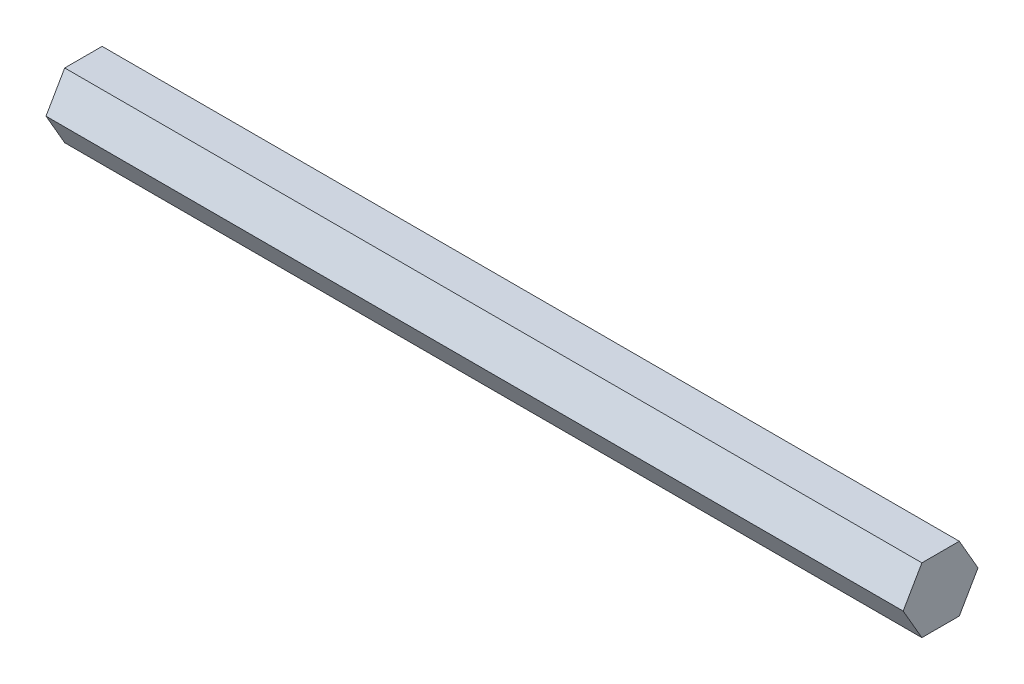
ISO-10303-21;
HEADER;
FILE_DESCRIPTION(('STEP AP214'),'2;1');
FILE_NAME('part.step','',(''),(''),'','','');
FILE_SCHEMA(('AUTOMOTIVE_DESIGN { 1 0 10303 214 1 1 1 1 }'));
ENDSEC;
DATA;
#1=APPLICATION_CONTEXT('core data for automotive mechanical design processes');
#2=APPLICATION_PROTOCOL_DEFINITION('international standard','automotive_design',2000,#1);
#3=PRODUCT_CONTEXT('',#1,'mechanical');
#4=PRODUCT('Part','Part','',(#3));
#5=PRODUCT_RELATED_PRODUCT_CATEGORY('part','',(#4));
#6=PRODUCT_DEFINITION_FORMATION('','',#4);
#7=PRODUCT_DEFINITION_CONTEXT('part definition',#1,'design');
#8=PRODUCT_DEFINITION('design','',#6,#7);
#9=PRODUCT_DEFINITION_SHAPE('','',#8);
#10=(LENGTH_UNIT() NAMED_UNIT(*) SI_UNIT(.MILLI.,.METRE.));
#11=(NAMED_UNIT(*) PLANE_ANGLE_UNIT() SI_UNIT($,.RADIAN.));
#12=(NAMED_UNIT(*) SI_UNIT($,.STERADIAN.) SOLID_ANGLE_UNIT());
#13=UNCERTAINTY_MEASURE_WITH_UNIT(LENGTH_MEASURE(1.E-05),#10,'distance_accuracy_value','');
#14=(GEOMETRIC_REPRESENTATION_CONTEXT(3) GLOBAL_UNCERTAINTY_ASSIGNED_CONTEXT((#13)) GLOBAL_UNIT_ASSIGNED_CONTEXT((#10,
#11,#12)) REPRESENTATION_CONTEXT('',''));
#15=CARTESIAN_POINT('',(0.,0.,0.));
#16=DIRECTION('',(0.,0.,1.));
#17=DIRECTION('',(1.,0.,0.));
#18=AXIS2_PLACEMENT_3D('',#15,#16,#17);
#19=CARTESIAN_POINT('',(168.,-6.34999999999996,-3.6661742093542));
#20=DIRECTION('',(0.,0.499999999999995,0.866025403784441));
#21=DIRECTION('',(0.,-0.866025403784442,0.499999999999995));
#22=AXIS2_PLACEMENT_3D('',#19,#20,#21);
#23=PLANE('',#22);
#24=DIRECTION('',(0.,0.866025403784441,-0.499999999999995));
#25=VECTOR('',#24,1.);
#26=CARTESIAN_POINT('',(0.,-6.34999999999996,-3.6661742093542));
#27=LINE('',#26,#25);
#28=CARTESIAN_POINT('',(0.,-6.34999999999996,-3.6661742093542));
#29=VERTEX_POINT('',#28);
#30=CARTESIAN_POINT('',(0.,0.,-7.33234841870825));
#31=VERTEX_POINT('',#30);
#32=EDGE_CURVE('E132',#29,#31,#27,.T.);
#33=ORIENTED_EDGE('',*,*,#32,.T.);
#34=DIRECTION('',(-1.,0.,0.));
#35=VECTOR('',#34,1.);
#36=CARTESIAN_POINT('',(168.,0.,-7.33234841870825));
#37=LINE('',#36,#35);
#38=CARTESIAN_POINT('',(168.,0.,-7.33234841870825));
#39=VERTEX_POINT('',#38);
#40=EDGE_CURVE('E11',#39,#31,#37,.T.);
#41=ORIENTED_EDGE('',*,*,#40,.F.);
#42=DIRECTION('',(0.,0.866025403784441,-0.499999999999995));
#43=VECTOR('',#42,1.);
#44=CARTESIAN_POINT('',(168.,-6.34999999999996,-3.6661742093542));
#45=LINE('',#44,#43);
#46=CARTESIAN_POINT('',(168.,-6.34999999999996,-3.6661742093542));
#47=VERTEX_POINT('',#46);
#48=EDGE_CURVE('E148',#47,#39,#45,.T.);
#49=ORIENTED_EDGE('',*,*,#48,.F.);
#50=DIRECTION('',(-1.,0.,0.));
#51=VECTOR('',#50,1.);
#52=CARTESIAN_POINT('',(168.,-6.34999999999996,-3.6661742093542));
#53=LINE('',#52,#51);
#54=EDGE_CURVE('E128',#47,#29,#53,.T.);
#55=ORIENTED_EDGE('',*,*,#54,.T.);
#56=EDGE_LOOP('',(#33,#41,#49,#55));
#57=FACE_BOUND('',#56,.T.);
#58=ADVANCED_FACE('F43',(#57),#23,.F.);
#59=CARTESIAN_POINT('',(168.,0.,-7.33234841870825));
#60=DIRECTION('',(0.,-0.500000000000001,0.866025403784438));
#61=DIRECTION('',(0.,-0.866025403784438,-0.500000000000001));
#62=AXIS2_PLACEMENT_3D('',#59,#60,#61);
#63=PLANE('',#62);
#64=DIRECTION('',(0.,0.866025403784438,0.500000000000001));
#65=VECTOR('',#64,1.);
#66=CARTESIAN_POINT('',(0.,0.,-7.33234841870825));
#67=LINE('',#66,#65);
#68=CARTESIAN_POINT('',(0.,6.35000000000001,-3.66617420935411));
#69=VERTEX_POINT('',#68);
#70=EDGE_CURVE('E136',#31,#69,#67,.T.);
#71=ORIENTED_EDGE('',*,*,#70,.T.);
#72=DIRECTION('',(-1.,0.,0.));
#73=VECTOR('',#72,1.);
#74=CARTESIAN_POINT('',(168.,6.35000000000001,-3.66617420935411));
#75=LINE('',#74,#73);
#76=CARTESIAN_POINT('',(168.,6.35000000000001,-3.66617420935411));
#77=VERTEX_POINT('',#76);
#78=EDGE_CURVE('E52',#77,#69,#75,.T.);
#79=ORIENTED_EDGE('',*,*,#78,.F.);
#80=DIRECTION('',(0.,0.866025403784438,0.500000000000001));
#81=VECTOR('',#80,1.);
#82=CARTESIAN_POINT('',(168.,0.,-7.33234841870825));
#83=LINE('',#82,#81);
#84=EDGE_CURVE('E97',#39,#77,#83,.T.);
#85=ORIENTED_EDGE('',*,*,#84,.F.);
#86=ORIENTED_EDGE('',*,*,#40,.T.);
#87=EDGE_LOOP('',(#71,#79,#85,#86));
#88=FACE_BOUND('',#87,.T.);
#89=ADVANCED_FACE('F176',(#88),#63,.F.);
#90=CARTESIAN_POINT('',(168.,6.35000000000001,-3.66617420935411));
#91=DIRECTION('',(0.,-1.,0.));
#92=DIRECTION('',(0.,0.,-1.));
#93=AXIS2_PLACEMENT_3D('',#90,#91,#92);
#94=PLANE('',#93);
#95=DIRECTION('',(0.,0.,1.));
#96=VECTOR('',#95,1.);
#97=CARTESIAN_POINT('',(0.,6.35000000000001,-3.66617420935411));
#98=LINE('',#97,#96);
#99=CARTESIAN_POINT('',(0.,6.34999999999999,3.66617420935415));
#100=VERTEX_POINT('',#99);
#101=EDGE_CURVE('E139',#69,#100,#98,.T.);
#102=ORIENTED_EDGE('',*,*,#101,.T.);
#103=DIRECTION('',(-1.,0.,0.));
#104=VECTOR('',#103,1.);
#105=CARTESIAN_POINT('',(168.,6.34999999999999,3.66617420935415));
#106=LINE('',#105,#104);
#107=CARTESIAN_POINT('',(168.,6.34999999999999,3.66617420935415));
#108=VERTEX_POINT('',#107);
#109=EDGE_CURVE('E121',#108,#100,#106,.T.);
#110=ORIENTED_EDGE('',*,*,#109,.F.);
#111=DIRECTION('',(0.,0.,1.));
#112=VECTOR('',#111,1.);
#113=CARTESIAN_POINT('',(168.,6.35000000000001,-3.66617420935411));
#114=LINE('',#113,#112);
#115=EDGE_CURVE('E110',#77,#108,#114,.T.);
#116=ORIENTED_EDGE('',*,*,#115,.F.);
#117=ORIENTED_EDGE('',*,*,#78,.T.);
#118=EDGE_LOOP('',(#102,#110,#116,#117));
#119=FACE_BOUND('',#118,.T.);
#120=ADVANCED_FACE('F158',(#119),#94,.F.);
#121=CARTESIAN_POINT('',(168.,6.34999999999999,3.66617420935415));
#122=DIRECTION('',(0.,-0.499999999999995,-0.866025403784441));
#123=DIRECTION('',(0.,0.866025403784442,-0.499999999999995));
#124=AXIS2_PLACEMENT_3D('',#121,#122,#123);
#125=PLANE('',#124);
#126=DIRECTION('',(0.,-0.866025403784442,0.499999999999995));
#127=VECTOR('',#126,1.);
#128=CARTESIAN_POINT('',(0.,6.34999999999999,3.66617420935415));
#129=LINE('',#128,#127);
#130=CARTESIAN_POINT('',(0.,0.,7.33234841870825));
#131=VERTEX_POINT('',#130);
#132=EDGE_CURVE('E119',#100,#131,#129,.T.);
#133=ORIENTED_EDGE('',*,*,#132,.T.);
#134=DIRECTION('',(-1.,0.,0.));
#135=VECTOR('',#134,1.);
#136=CARTESIAN_POINT('',(168.,0.,7.33234841870825));
#137=LINE('',#136,#135);
#138=CARTESIAN_POINT('',(168.,0.,7.33234841870825));
#139=VERTEX_POINT('',#138);
#140=EDGE_CURVE('E116',#139,#131,#137,.T.);
#141=ORIENTED_EDGE('',*,*,#140,.F.);
#142=DIRECTION('',(0.,-0.866025403784442,0.499999999999995));
#143=VECTOR('',#142,1.);
#144=CARTESIAN_POINT('',(168.,6.34999999999999,3.66617420935415));
#145=LINE('',#144,#143);
#146=EDGE_CURVE('E104',#108,#139,#145,.T.);
#147=ORIENTED_EDGE('',*,*,#146,.F.);
#148=ORIENTED_EDGE('',*,*,#109,.T.);
#149=EDGE_LOOP('',(#133,#141,#147,#148));
#150=FACE_BOUND('',#149,.T.);
#151=ADVANCED_FACE('F117',(#150),#125,.F.);
#152=CARTESIAN_POINT('',(168.,0.,7.33234841870825));
#153=DIRECTION('',(0.,0.500000000000007,-0.866025403784434));
#154=DIRECTION('',(0.,0.866025403784435,0.500000000000007));
#155=AXIS2_PLACEMENT_3D('',#152,#153,#154);
#156=PLANE('',#155);
#157=DIRECTION('',(0.,-0.866025403784434,-0.500000000000007));
#158=VECTOR('',#157,1.);
#159=CARTESIAN_POINT('',(0.,0.,7.33234841870825));
#160=LINE('',#159,#158);
#161=CARTESIAN_POINT('',(0.,-6.35000000000004,3.66617420935407));
#162=VERTEX_POINT('',#161);
#163=EDGE_CURVE('E83',#131,#162,#160,.T.);
#164=ORIENTED_EDGE('',*,*,#163,.T.);
#165=DIRECTION('',(-1.,0.,0.));
#166=VECTOR('',#165,1.);
#167=CARTESIAN_POINT('',(168.,-6.35000000000004,3.66617420935407));
#168=LINE('',#167,#166);
#169=CARTESIAN_POINT('',(168.,-6.35000000000004,3.66617420935407));
#170=VERTEX_POINT('',#169);
#171=EDGE_CURVE('E122',#170,#162,#168,.T.);
#172=ORIENTED_EDGE('',*,*,#171,.F.);
#173=DIRECTION('',(0.,-0.866025403784434,-0.500000000000007));
#174=VECTOR('',#173,1.);
#175=CARTESIAN_POINT('',(168.,0.,7.33234841870825));
#176=LINE('',#175,#174);
#177=EDGE_CURVE('E108',#139,#170,#176,.T.);
#178=ORIENTED_EDGE('',*,*,#177,.F.);
#179=ORIENTED_EDGE('',*,*,#140,.T.);
#180=EDGE_LOOP('',(#164,#172,#178,#179));
#181=FACE_BOUND('',#180,.T.);
#182=ADVANCED_FACE('F124',(#181),#156,.F.);
#183=CARTESIAN_POINT('',(168.,-6.35000000000004,3.66617420935407));
#184=DIRECTION('',(0.,1.,0.));
#185=DIRECTION('',(0.,0.,1.));
#186=AXIS2_PLACEMENT_3D('',#183,#184,#185);
#187=PLANE('',#186);
#188=DIRECTION('',(0.,0.,-1.));
#189=VECTOR('',#188,1.);
#190=CARTESIAN_POINT('',(0.,-6.35000000000004,3.66617420935407));
#191=LINE('',#190,#189);
#192=EDGE_CURVE('E89',#162,#29,#191,.T.);
#193=ORIENTED_EDGE('',*,*,#192,.T.);
#194=ORIENTED_EDGE('',*,*,#54,.F.);
#195=DIRECTION('',(0.,0.,-1.));
#196=VECTOR('',#195,1.);
#197=CARTESIAN_POINT('',(168.,-6.35000000000004,3.66617420935407));
#198=LINE('',#197,#196);
#199=EDGE_CURVE('E60',#170,#47,#198,.T.);
#200=ORIENTED_EDGE('',*,*,#199,.F.);
#201=ORIENTED_EDGE('',*,*,#171,.T.);
#202=EDGE_LOOP('',(#193,#194,#200,#201));
#203=FACE_BOUND('',#202,.T.);
#204=ADVANCED_FACE('F165',(#203),#187,.F.);
#205=CARTESIAN_POINT('',(168.,0.,0.));
#206=DIRECTION('',(1.,0.,0.));
#207=DIRECTION('',(0.,0.,-1.));
#208=AXIS2_PLACEMENT_3D('',#205,#206,#207);
#209=PLANE('',#208);
#210=ORIENTED_EDGE('',*,*,#48,.T.);
#211=ORIENTED_EDGE('',*,*,#84,.T.);
#212=ORIENTED_EDGE('',*,*,#115,.T.);
#213=ORIENTED_EDGE('',*,*,#146,.T.);
#214=ORIENTED_EDGE('',*,*,#177,.T.);
#215=ORIENTED_EDGE('',*,*,#199,.T.);
#216=EDGE_LOOP('',(#210,#211,#212,#213,#214,#215));
#217=FACE_BOUND('',#216,.T.);
#218=ADVANCED_FACE('F106',(#217),#209,.T.);
#219=CARTESIAN_POINT('',(0.,0.,0.));
#220=DIRECTION('',(1.,0.,0.));
#221=DIRECTION('',(0.,0.,-1.));
#222=AXIS2_PLACEMENT_3D('',#219,#220,#221);
#223=PLANE('',#222);
#224=ORIENTED_EDGE('',*,*,#32,.F.);
#225=ORIENTED_EDGE('',*,*,#192,.F.);
#226=ORIENTED_EDGE('',*,*,#163,.F.);
#227=ORIENTED_EDGE('',*,*,#132,.F.);
#228=ORIENTED_EDGE('',*,*,#101,.F.);
#229=ORIENTED_EDGE('',*,*,#70,.F.);
#230=EDGE_LOOP('',(#224,#225,#226,#227,#228,#229));
#231=FACE_BOUND('',#230,.T.);
#232=ADVANCED_FACE('F161',(#231),#223,.F.);
#233=CLOSED_SHELL('',(#58,#89,#120,#151,#182,#204,#218,#232));
#234=MANIFOLD_SOLID_BREP('B2',#233);
#235=ADVANCED_BREP_SHAPE_REPRESENTATION('',(#18,#234),#14);
#236=SHAPE_DEFINITION_REPRESENTATION(#9,#235);
ENDSEC;
END-ISO-10303-21;
